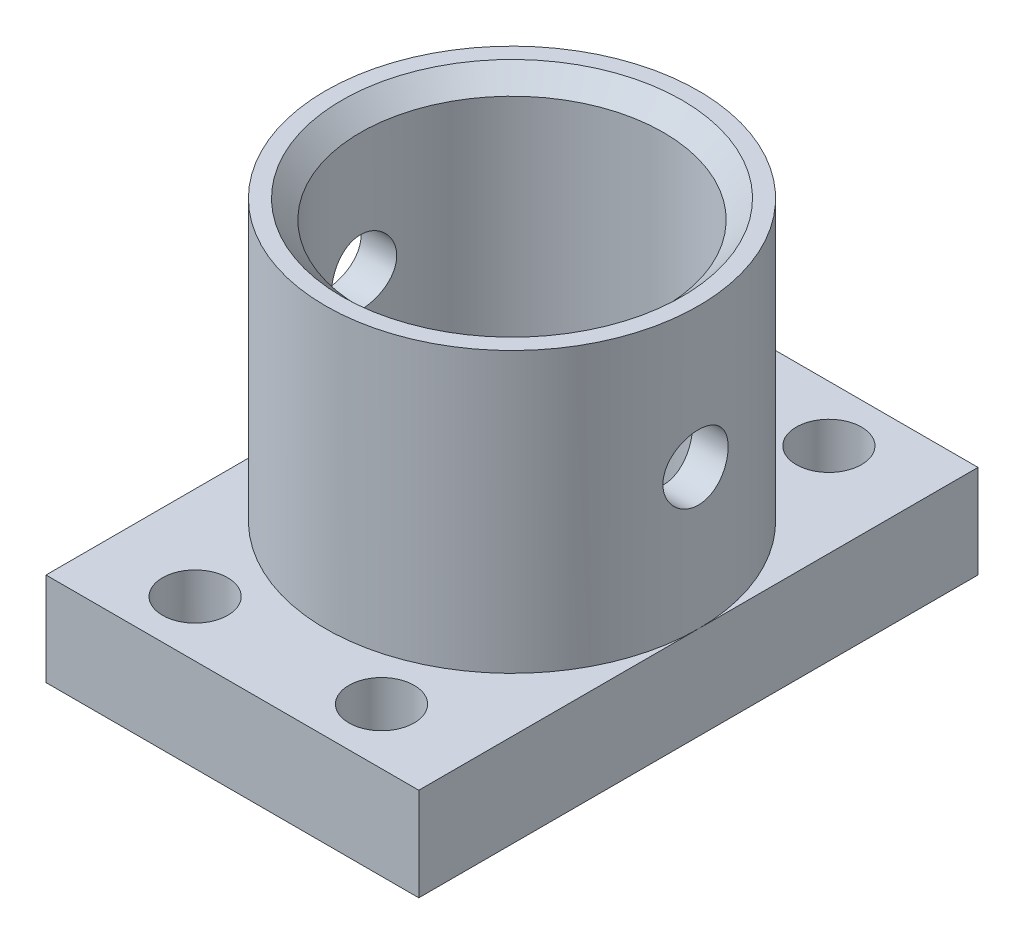
ISO-10303-21;
HEADER;
FILE_DESCRIPTION(('STEP AP214'),'2;1');
FILE_NAME('part.step','',(''),(''),'','','');
FILE_SCHEMA(('AUTOMOTIVE_DESIGN { 1 0 10303 214 1 1 1 1 }'));
ENDSEC;
DATA;
#1=APPLICATION_CONTEXT('core data for automotive mechanical design processes');
#2=APPLICATION_PROTOCOL_DEFINITION('international standard','automotive_design',2000,#1);
#3=PRODUCT_CONTEXT('',#1,'mechanical');
#4=PRODUCT('Part','Part','',(#3));
#5=PRODUCT_RELATED_PRODUCT_CATEGORY('part','',(#4));
#6=PRODUCT_DEFINITION_FORMATION('','',#4);
#7=PRODUCT_DEFINITION_CONTEXT('part definition',#1,'design');
#8=PRODUCT_DEFINITION('design','',#6,#7);
#9=PRODUCT_DEFINITION_SHAPE('','',#8);
#10=(LENGTH_UNIT() NAMED_UNIT(*) SI_UNIT(.MILLI.,.METRE.));
#11=(NAMED_UNIT(*) PLANE_ANGLE_UNIT() SI_UNIT($,.RADIAN.));
#12=(NAMED_UNIT(*) SI_UNIT($,.STERADIAN.) SOLID_ANGLE_UNIT());
#13=UNCERTAINTY_MEASURE_WITH_UNIT(LENGTH_MEASURE(1.E-05),#10,'distance_accuracy_value','');
#14=(GEOMETRIC_REPRESENTATION_CONTEXT(3) GLOBAL_UNCERTAINTY_ASSIGNED_CONTEXT((#13)) GLOBAL_UNIT_ASSIGNED_CONTEXT((#10,
#11,#12)) REPRESENTATION_CONTEXT('',''));
#15=CARTESIAN_POINT('',(0.,0.,0.));
#16=DIRECTION('',(0.,0.,1.));
#17=DIRECTION('',(1.,0.,0.));
#18=AXIS2_PLACEMENT_3D('',#15,#16,#17);
#19=CARTESIAN_POINT('',(0.,5.,0.));
#20=DIRECTION('',(0.,-1.,0.));
#21=DIRECTION('',(0.,0.,-1.));
#22=AXIS2_PLACEMENT_3D('',#19,#20,#21);
#23=PLANE('',#22);
#24=CARTESIAN_POINT('',(5.,5.,-12.));
#25=DIRECTION('',(0.,1.,0.));
#26=DIRECTION('',(0.,0.,1.));
#27=AXIS2_PLACEMENT_3D('',#24,#25,#26);
#28=CIRCLE('',#27,1.75);
#29=CARTESIAN_POINT('',(5.,5.,-10.25));
#30=VERTEX_POINT('',#29);
#31=EDGE_CURVE('E235',#30,#30,#28,.T.);
#32=ORIENTED_EDGE('',*,*,#31,.F.);
#33=EDGE_LOOP('',(#32));
#34=FACE_BOUND('',#33,.T.);
#35=CARTESIAN_POINT('',(-5.,5.,-12.));
#36=DIRECTION('',(0.,1.,0.));
#37=DIRECTION('',(0.,0.,1.));
#38=AXIS2_PLACEMENT_3D('',#35,#36,#37);
#39=CIRCLE('',#38,1.75);
#40=CARTESIAN_POINT('',(-5.,5.,-10.25));
#41=VERTEX_POINT('',#40);
#42=EDGE_CURVE('E238',#41,#41,#39,.T.);
#43=ORIENTED_EDGE('',*,*,#42,.F.);
#44=EDGE_LOOP('',(#43));
#45=FACE_BOUND('',#44,.T.);
#46=CARTESIAN_POINT('',(0.,5.,0.));
#47=DIRECTION('',(0.,1.,0.));
#48=DIRECTION('',(0.,0.,1.));
#49=AXIS2_PLACEMENT_3D('',#46,#47,#48);
#50=CIRCLE('',#49,10.);
#51=CARTESIAN_POINT('',(10.,5.,0.));
#52=VERTEX_POINT('',#51);
#53=CARTESIAN_POINT('',(-10.,5.,0.));
#54=VERTEX_POINT('',#53);
#55=EDGE_CURVE('E122',#52,#54,#50,.T.);
#56=ORIENTED_EDGE('',*,*,#55,.F.);
#57=DIRECTION('',(0.,0.,-1.));
#58=VECTOR('',#57,1.);
#59=CARTESIAN_POINT('',(10.,5.,15.));
#60=LINE('',#59,#58);
#61=CARTESIAN_POINT('',(10.,5.,-15.));
#62=VERTEX_POINT('',#61);
#63=EDGE_CURVE('E104',#52,#62,#60,.T.);
#64=ORIENTED_EDGE('',*,*,#63,.T.);
#65=DIRECTION('',(-1.,0.,0.));
#66=VECTOR('',#65,1.);
#67=CARTESIAN_POINT('',(-10.,5.,-15.));
#68=LINE('',#67,#66);
#69=CARTESIAN_POINT('',(-10.,5.,-15.));
#70=VERTEX_POINT('',#69);
#71=EDGE_CURVE('E112',#62,#70,#68,.T.);
#72=ORIENTED_EDGE('',*,*,#71,.T.);
#73=DIRECTION('',(0.,0.,1.));
#74=VECTOR('',#73,1.);
#75=CARTESIAN_POINT('',(-10.,5.,15.));
#76=LINE('',#75,#74);
#77=EDGE_CURVE('E124',#70,#54,#76,.T.);
#78=ORIENTED_EDGE('',*,*,#77,.T.);
#79=EDGE_LOOP('',(#56,#64,#72,#78));
#80=FACE_BOUND('',#79,.T.);
#81=ADVANCED_FACE('F45',(#34,#45,#80),#23,.F.);
#82=CARTESIAN_POINT('',(10.,5.,15.));
#83=DIRECTION('',(-1.,0.,0.));
#84=DIRECTION('',(0.,0.,1.));
#85=AXIS2_PLACEMENT_3D('',#82,#83,#84);
#86=PLANE('',#85);
#87=DIRECTION('',(0.,0.,-1.));
#88=VECTOR('',#87,1.);
#89=CARTESIAN_POINT('',(10.,0.,15.));
#90=LINE('',#89,#88);
#91=CARTESIAN_POINT('',(10.,0.,15.));
#92=VERTEX_POINT('',#91);
#93=CARTESIAN_POINT('',(10.,0.,-15.));
#94=VERTEX_POINT('',#93);
#95=EDGE_CURVE('E149',#92,#94,#90,.T.);
#96=ORIENTED_EDGE('',*,*,#95,.T.);
#97=DIRECTION('',(0.,-1.,0.));
#98=VECTOR('',#97,1.);
#99=CARTESIAN_POINT('',(10.,5.,-15.));
#100=LINE('',#99,#98);
#101=EDGE_CURVE('E118',#62,#94,#100,.T.);
#102=ORIENTED_EDGE('',*,*,#101,.F.);
#103=ORIENTED_EDGE('',*,*,#63,.F.);
#104=CARTESIAN_POINT('',(10.,5.,15.));
#105=VERTEX_POINT('',#104);
#106=EDGE_CURVE('E108',#105,#52,#60,.T.);
#107=ORIENTED_EDGE('',*,*,#106,.F.);
#108=DIRECTION('',(0.,-1.,0.));
#109=VECTOR('',#108,1.);
#110=CARTESIAN_POINT('',(10.,5.,15.));
#111=LINE('',#110,#109);
#112=EDGE_CURVE('E148',#105,#92,#111,.T.);
#113=ORIENTED_EDGE('',*,*,#112,.T.);
#114=EDGE_LOOP('',(#96,#102,#103,#107,#113));
#115=FACE_BOUND('',#114,.T.);
#116=ADVANCED_FACE('F116',(#115),#86,.F.);
#117=CARTESIAN_POINT('',(-10.,5.,-15.));
#118=DIRECTION('',(0.,0.,1.));
#119=DIRECTION('',(1.,0.,0.));
#120=AXIS2_PLACEMENT_3D('',#117,#118,#119);
#121=PLANE('',#120);
#122=DIRECTION('',(-1.,0.,0.));
#123=VECTOR('',#122,1.);
#124=CARTESIAN_POINT('',(-10.,0.,-15.));
#125=LINE('',#124,#123);
#126=CARTESIAN_POINT('',(-10.,0.,-15.));
#127=VERTEX_POINT('',#126);
#128=EDGE_CURVE('E152',#94,#127,#125,.T.);
#129=ORIENTED_EDGE('',*,*,#128,.T.);
#130=DIRECTION('',(0.,-1.,0.));
#131=VECTOR('',#130,1.);
#132=CARTESIAN_POINT('',(-10.,5.,-15.));
#133=LINE('',#132,#131);
#134=EDGE_CURVE('E136',#70,#127,#133,.T.);
#135=ORIENTED_EDGE('',*,*,#134,.F.);
#136=ORIENTED_EDGE('',*,*,#71,.F.);
#137=ORIENTED_EDGE('',*,*,#101,.T.);
#138=EDGE_LOOP('',(#129,#135,#136,#137));
#139=FACE_BOUND('',#138,.T.);
#140=ADVANCED_FACE('F221',(#139),#121,.F.);
#141=CARTESIAN_POINT('',(-10.,5.,15.));
#142=DIRECTION('',(1.,0.,0.));
#143=DIRECTION('',(0.,0.,-1.));
#144=AXIS2_PLACEMENT_3D('',#141,#142,#143);
#145=PLANE('',#144);
#146=DIRECTION('',(0.,0.,1.));
#147=VECTOR('',#146,1.);
#148=CARTESIAN_POINT('',(-10.,0.,15.));
#149=LINE('',#148,#147);
#150=CARTESIAN_POINT('',(-10.,0.,15.));
#151=VERTEX_POINT('',#150);
#152=EDGE_CURVE('E155',#127,#151,#149,.T.);
#153=ORIENTED_EDGE('',*,*,#152,.T.);
#154=DIRECTION('',(0.,-1.,0.));
#155=VECTOR('',#154,1.);
#156=CARTESIAN_POINT('',(-10.,5.,15.));
#157=LINE('',#156,#155);
#158=CARTESIAN_POINT('',(-10.,5.,15.));
#159=VERTEX_POINT('',#158);
#160=EDGE_CURVE('E162',#159,#151,#157,.T.);
#161=ORIENTED_EDGE('',*,*,#160,.F.);
#162=EDGE_CURVE('E143',#54,#159,#76,.T.);
#163=ORIENTED_EDGE('',*,*,#162,.F.);
#164=ORIENTED_EDGE('',*,*,#77,.F.);
#165=ORIENTED_EDGE('',*,*,#134,.T.);
#166=EDGE_LOOP('',(#153,#161,#163,#164,#165));
#167=FACE_BOUND('',#166,.T.);
#168=ADVANCED_FACE('F218',(#167),#145,.F.);
#169=CARTESIAN_POINT('',(-10.,5.,15.));
#170=DIRECTION('',(0.,0.,-1.));
#171=DIRECTION('',(-1.,0.,0.));
#172=AXIS2_PLACEMENT_3D('',#169,#170,#171);
#173=PLANE('',#172);
#174=DIRECTION('',(1.,0.,0.));
#175=VECTOR('',#174,1.);
#176=CARTESIAN_POINT('',(-10.,0.,15.));
#177=LINE('',#176,#175);
#178=EDGE_CURVE('E96',#151,#92,#177,.T.);
#179=ORIENTED_EDGE('',*,*,#178,.T.);
#180=ORIENTED_EDGE('',*,*,#112,.F.);
#181=DIRECTION('',(1.,0.,0.));
#182=VECTOR('',#181,1.);
#183=CARTESIAN_POINT('',(-10.,5.,15.));
#184=LINE('',#183,#182);
#185=EDGE_CURVE('E75',#159,#105,#184,.T.);
#186=ORIENTED_EDGE('',*,*,#185,.F.);
#187=ORIENTED_EDGE('',*,*,#160,.T.);
#188=EDGE_LOOP('',(#179,#180,#186,#187));
#189=FACE_BOUND('',#188,.T.);
#190=ADVANCED_FACE('F211',(#189),#173,.F.);
#191=CARTESIAN_POINT('',(-4.99999999999907,5.,12.));
#192=DIRECTION('',(0.,1.,0.));
#193=DIRECTION('',(0.,0.,1.));
#194=AXIS2_PLACEMENT_3D('',#191,#192,#193);
#195=CIRCLE('',#194,1.74999999999967);
#196=CARTESIAN_POINT('',(-4.99999999999907,5.,13.7499999999997));
#197=VERTEX_POINT('',#196);
#198=EDGE_CURVE('E250',#197,#197,#195,.T.);
#199=ORIENTED_EDGE('',*,*,#198,.F.);
#200=EDGE_LOOP('',(#199));
#201=FACE_BOUND('',#200,.T.);
#202=CARTESIAN_POINT('',(5.00000000000093,5.,12.));
#203=DIRECTION('',(0.,1.,0.));
#204=DIRECTION('',(0.,0.,1.));
#205=AXIS2_PLACEMENT_3D('',#202,#203,#204);
#206=CIRCLE('',#205,1.75);
#207=CARTESIAN_POINT('',(5.00000000000093,5.,13.75));
#208=VERTEX_POINT('',#207);
#209=EDGE_CURVE('E435',#208,#208,#206,.T.);
#210=ORIENTED_EDGE('',*,*,#209,.F.);
#211=EDGE_LOOP('',(#210));
#212=FACE_BOUND('',#211,.T.);
#213=EDGE_CURVE('E69',#54,#52,#50,.T.);
#214=ORIENTED_EDGE('',*,*,#213,.F.);
#215=ORIENTED_EDGE('',*,*,#162,.T.);
#216=ORIENTED_EDGE('',*,*,#185,.T.);
#217=ORIENTED_EDGE('',*,*,#106,.T.);
#218=EDGE_LOOP('',(#214,#215,#216,#217));
#219=FACE_BOUND('',#218,.T.);
#220=ADVANCED_FACE('F109',(#201,#212,#219),#23,.F.);
#221=CARTESIAN_POINT('',(0.,0.,0.));
#222=DIRECTION('',(0.,-1.,0.));
#223=DIRECTION('',(0.,0.,-1.));
#224=AXIS2_PLACEMENT_3D('',#221,#222,#223);
#225=PLANE('',#224);
#226=CARTESIAN_POINT('',(-4.99999999999907,0.,12.));
#227=DIRECTION('',(0.,-1.,0.));
#228=DIRECTION('',(0.,0.,-1.));
#229=AXIS2_PLACEMENT_3D('',#226,#227,#228);
#230=CIRCLE('',#229,1.74999999999967);
#231=CARTESIAN_POINT('',(-4.99999999999907,0.,10.2500000000003));
#232=VERTEX_POINT('',#231);
#233=EDGE_CURVE('E443',#232,#232,#230,.F.);
#234=ORIENTED_EDGE('',*,*,#233,.T.);
#235=EDGE_LOOP('',(#234));
#236=FACE_BOUND('',#235,.T.);
#237=CARTESIAN_POINT('',(5.00000000000093,0.,12.));
#238=DIRECTION('',(0.,-1.,0.));
#239=DIRECTION('',(0.,0.,-1.));
#240=AXIS2_PLACEMENT_3D('',#237,#238,#239);
#241=CIRCLE('',#240,1.75);
#242=CARTESIAN_POINT('',(5.00000000000093,0.,10.25));
#243=VERTEX_POINT('',#242);
#244=EDGE_CURVE('E438',#243,#243,#241,.F.);
#245=ORIENTED_EDGE('',*,*,#244,.T.);
#246=EDGE_LOOP('',(#245));
#247=FACE_BOUND('',#246,.T.);
#248=CARTESIAN_POINT('',(5.,0.,-12.));
#249=DIRECTION('',(0.,-1.,0.));
#250=DIRECTION('',(0.,0.,-1.));
#251=AXIS2_PLACEMENT_3D('',#248,#249,#250);
#252=CIRCLE('',#251,1.75);
#253=CARTESIAN_POINT('',(5.,0.,-13.75));
#254=VERTEX_POINT('',#253);
#255=EDGE_CURVE('E247',#254,#254,#252,.F.);
#256=ORIENTED_EDGE('',*,*,#255,.T.);
#257=EDGE_LOOP('',(#256));
#258=FACE_BOUND('',#257,.T.);
#259=CARTESIAN_POINT('',(-5.,0.,-12.));
#260=DIRECTION('',(0.,-1.,0.));
#261=DIRECTION('',(0.,0.,-1.));
#262=AXIS2_PLACEMENT_3D('',#259,#260,#261);
#263=CIRCLE('',#262,1.75);
#264=CARTESIAN_POINT('',(-5.,0.,-13.75));
#265=VERTEX_POINT('',#264);
#266=EDGE_CURVE('E241',#265,#265,#263,.F.);
#267=ORIENTED_EDGE('',*,*,#266,.T.);
#268=EDGE_LOOP('',(#267));
#269=FACE_BOUND('',#268,.T.);
#270=CARTESIAN_POINT('',(0.,0.,0.));
#271=DIRECTION('',(0.,1.,0.));
#272=DIRECTION('',(0.,0.,1.));
#273=AXIS2_PLACEMENT_3D('',#270,#271,#272);
#274=CIRCLE('',#273,8.125);
#275=CARTESIAN_POINT('',(0.,0.,8.125));
#276=VERTEX_POINT('',#275);
#277=EDGE_CURVE('E128',#276,#276,#274,.T.);
#278=ORIENTED_EDGE('',*,*,#277,.T.);
#279=EDGE_LOOP('',(#278));
#280=FACE_BOUND('',#279,.T.);
#281=ORIENTED_EDGE('',*,*,#95,.F.);
#282=ORIENTED_EDGE('',*,*,#178,.F.);
#283=ORIENTED_EDGE('',*,*,#152,.F.);
#284=ORIENTED_EDGE('',*,*,#128,.F.);
#285=EDGE_LOOP('',(#281,#282,#283,#284));
#286=FACE_BOUND('',#285,.T.);
#287=ADVANCED_FACE('F210',(#236,#247,#258,#269,#280,#286),#225,.T.);
#288=CARTESIAN_POINT('',(0.,20.,0.));
#289=DIRECTION('',(0.,1.,0.));
#290=DIRECTION('',(0.,0.,1.));
#291=AXIS2_PLACEMENT_3D('',#288,#289,#290);
#292=PLANE('',#291);
#293=CARTESIAN_POINT('',(0.,20.,0.));
#294=DIRECTION('',(0.,1.,0.));
#295=DIRECTION('',(0.,0.,1.));
#296=AXIS2_PLACEMENT_3D('',#293,#294,#295);
#297=CIRCLE('',#296,9.125);
#298=CARTESIAN_POINT('',(0.,20.,9.125));
#299=VERTEX_POINT('',#298);
#300=EDGE_CURVE('E11',#299,#299,#297,.F.);
#301=ORIENTED_EDGE('',*,*,#300,.T.);
#302=EDGE_LOOP('',(#301));
#303=FACE_BOUND('',#302,.T.);
#304=CARTESIAN_POINT('',(0.,20.,0.));
#305=DIRECTION('',(0.,1.,0.));
#306=DIRECTION('',(0.,0.,1.));
#307=AXIS2_PLACEMENT_3D('',#304,#305,#306);
#308=CIRCLE('',#307,10.);
#309=CARTESIAN_POINT('',(0.,20.,10.));
#310=VERTEX_POINT('',#309);
#311=EDGE_CURVE('E127',#310,#310,#308,.T.);
#312=ORIENTED_EDGE('',*,*,#311,.T.);
#313=EDGE_LOOP('',(#312));
#314=FACE_BOUND('',#313,.T.);
#315=ADVANCED_FACE('F205',(#303,#314),#292,.T.);
#316=CARTESIAN_POINT('',(0.,20.,0.));
#317=DIRECTION('',(0.,-1.,0.));
#318=DIRECTION('',(0.,0.,-1.));
#319=AXIS2_PLACEMENT_3D('',#316,#317,#318);
#320=CYLINDRICAL_SURFACE('',#319,10.);
#321=CARTESIAN_POINT('',(-10.,10.75,0.));
#322=CARTESIAN_POINT('',(-9.99999828550993,10.7500038423549,-0.0975002189978536));
#323=CARTESIAN_POINT('',(-9.99855925305814,10.7581757812618,-0.195051825485916));
#324=CARTESIAN_POINT('',(-9.99295728726595,10.7906311549575,-0.387414018862526));
#325=CARTESIAN_POINT('',(-9.98879192868944,10.8149289349511,-0.482222086719285));
#326=CARTESIAN_POINT('',(-9.9782040279162,10.878875737995,-0.666286716106654));
#327=CARTESIAN_POINT('',(-9.97178340721726,10.9185116957341,-0.755547927638464));
#328=CARTESIAN_POINT('',(-9.95738907196248,11.011974384061,-0.92614297536967));
#329=CARTESIAN_POINT('',(-9.94941551484514,11.065799676313,-1.00747761392112));
#330=CARTESIAN_POINT('',(-9.93270416872809,11.1867136097796,-1.16077458064916));
#331=CARTESIAN_POINT('',(-9.92395990203815,11.2539221396422,-1.23264164981102));
#332=CARTESIAN_POINT('',(-9.90674166321202,11.3994367369352,-1.36414009649868));
#333=CARTESIAN_POINT('',(-9.89826770904785,11.4777435403702,-1.4237706618935));
#334=CARTESIAN_POINT('',(-9.88248675123969,11.6438935627265,-1.52949079919484));
#335=CARTESIAN_POINT('',(-9.87518811175402,11.7317982531034,-1.57548512024472));
#336=CARTESIAN_POINT('',(-9.86267461199112,11.9142353924078,-1.65201780170523));
#337=CARTESIAN_POINT('',(-9.85745959606453,12.0087673456498,-1.68255731665529));
#338=CARTESIAN_POINT('',(-9.84976858920675,12.2007620314414,-1.7270111605903));
#339=CARTESIAN_POINT('',(-9.84726541290427,12.2981854220943,-1.74109061199911));
#340=CARTESIAN_POINT('',(-9.84519938186275,12.4940414676184,-1.75273685009326));
#341=CARTESIAN_POINT('',(-9.84563629768553,12.5924740431367,-1.75030492528908));
#342=CARTESIAN_POINT('',(-9.84937629026662,12.7863688504328,-1.72913170713863));
#343=CARTESIAN_POINT('',(-9.85264661495795,12.8818521571407,-1.71057677642296));
#344=CARTESIAN_POINT('',(-9.86163360747697,13.0683292323422,-1.6579771161493));
#345=CARTESIAN_POINT('',(-9.8673503670103,13.1593228323945,-1.62393180592483));
#346=CARTESIAN_POINT('',(-9.88062103436221,13.3347905445086,-1.54113146110185));
#347=CARTESIAN_POINT('',(-9.88818446324518,13.4192277798609,-1.49229986742933));
#348=CARTESIAN_POINT('',(-9.9042897774119,13.5787803690809,-1.38136737793409));
#349=CARTESIAN_POINT('',(-9.91283174952347,13.6538948944947,-1.31926530417514));
#350=CARTESIAN_POINT('',(-9.93007513845501,13.7937478344988,-1.18254340376588));
#351=CARTESIAN_POINT('',(-9.93877713730826,13.8583301455674,-1.10776386811214));
#352=CARTESIAN_POINT('',(-9.95525225092692,13.9740549442254,-0.94834768117737));
#353=CARTESIAN_POINT('',(-9.96302535851272,14.0251973279382,-0.863710953717842));
#354=CARTESIAN_POINT('',(-9.9767796289067,14.1126081081559,-0.686829936517548));
#355=CARTESIAN_POINT('',(-9.98275901510707,14.148861771016,-0.594578218974182));
#356=CARTESIAN_POINT('',(-9.99223809398106,14.2053161469363,-0.405166996122792));
#357=CARTESIAN_POINT('',(-9.99573801564457,14.2255183424439,-0.308007944917597));
#358=CARTESIAN_POINT('',(-9.99983277218685,14.2490825152256,-0.11288455469102));
#359=CARTESIAN_POINT('',(-10.0004645449945,14.2526586288013,-0.0149468247783651));
#360=CARTESIAN_POINT('',(-9.99885332409997,14.2434413739277,0.180127849653308));
#361=CARTESIAN_POINT('',(-9.99661045277387,14.2306487023114,0.277264828083825));
#362=CARTESIAN_POINT('',(-9.98952487073635,14.1892351057355,0.467312333780238));
#363=CARTESIAN_POINT('',(-9.98469972832698,14.1607211005893,0.560246871912318));
#364=CARTESIAN_POINT('',(-9.97298839379761,14.0887888897806,0.740016494745392));
#365=CARTESIAN_POINT('',(-9.96610207629161,14.0453697773825,0.826851207983177));
#366=CARTESIAN_POINT('',(-9.95094034029615,13.9443758119241,0.992880142059946));
#367=CARTESIAN_POINT('',(-9.94265215093101,13.886668321633,1.07199249157212));
#368=CARTESIAN_POINT('',(-9.92564223228564,13.7589169998669,1.21948701016864));
#369=CARTESIAN_POINT('',(-9.91692046810972,13.6888721742803,1.28786831373204));
#370=CARTESIAN_POINT('',(-9.89990574738798,13.5374705049389,1.4127611499402));
#371=CARTESIAN_POINT('',(-9.89161886212633,13.4559930439062,1.46912742425077));
#372=CARTESIAN_POINT('',(-9.87652886958087,13.2846001692963,1.5673730724115));
#373=CARTESIAN_POINT('',(-9.86972571190741,13.1946850424234,1.60925293827065));
#374=CARTESIAN_POINT('',(-9.85841982497657,13.0093608772062,1.67712403732702));
#375=CARTESIAN_POINT('',(-9.8539069632688,12.9139781523736,1.70318535525293));
#376=CARTESIAN_POINT('',(-9.84766806310623,12.7201026745908,1.73889853467115));
#377=CARTESIAN_POINT('',(-9.84594175488491,12.6216102236348,1.74855198461554));
#378=CARTESIAN_POINT('',(-9.84548385302428,12.4257632938701,1.75112765296471));
#379=CARTESIAN_POINT('',(-9.84671130349954,12.3284118452215,1.74427868698102));
#380=CARTESIAN_POINT('',(-9.85193244878435,12.1362698766224,1.71454110321866));
#381=CARTESIAN_POINT('',(-9.85592613187508,12.0414793458245,1.6916525533898));
#382=CARTESIAN_POINT('',(-9.8662135332826,11.8572518573066,1.63057667594736));
#383=CARTESIAN_POINT('',(-9.87250399231302,11.7678075212446,1.59241102026491));
#384=CARTESIAN_POINT('',(-9.88667897086147,11.5965545722039,1.50188835743546));
#385=CARTESIAN_POINT('',(-9.89456358259495,11.5147464013474,1.44953052926745));
#386=CARTESIAN_POINT('',(-9.91116727642969,11.3599357127572,1.33130126747894));
#387=CARTESIAN_POINT('',(-9.91989591712334,11.2870622415423,1.26526217529781));
#388=CARTESIAN_POINT('',(-9.93712979259031,11.1533537998188,1.12189721587278));
#389=CARTESIAN_POINT('',(-9.94563497547267,11.092521604455,1.04456875389407));
#390=CARTESIAN_POINT('',(-9.96153989384367,10.9841905933561,0.880110187392864));
#391=CARTESIAN_POINT('',(-9.9689306174897,10.9367980008952,0.792909225494813));
#392=CARTESIAN_POINT('',(-9.98168617899541,10.8574087241303,0.611686626292545));
#393=CARTESIAN_POINT('',(-9.98705298938607,10.8253970410154,0.517671737050139));
#394=CARTESIAN_POINT('',(-9.99401440275851,10.7844544193603,0.352770470007627));
#395=CARTESIAN_POINT('',(-9.99624674471591,10.7715552330515,0.282869378105653));
#396=CARTESIAN_POINT('',(-9.99924015281871,10.7543267106156,0.141987928142367));
#397=CARTESIAN_POINT('',(-10.0000012486312,10.7499972016845,0.0710075918726424));
#398=CARTESIAN_POINT('',(-10.,10.75,0.));
#399=B_SPLINE_CURVE_WITH_KNOTS('',3,(#321,#322,#323,#324,#325,#326,#327,#328,#329,#330,#331,
#332,#333,#334,#335,#336,#337,#338,#339,#340,#341,#342,#343,#344,#345,#346,#347,#348,#349,#350,
#351,#352,#353,#354,#355,#356,#357,#358,#359,#360,#361,#362,#363,#364,#365,#366,#367,#368,#369,
#370,#371,#372,#373,#374,#375,#376,#377,#378,#379,#380,#381,#382,#383,#384,#385,#386,#387,#388,
#389,#390,#391,#392,#393,#394,#395,#396,#397,#398),.UNSPECIFIED.,.T.,.F.,(4,2,2,2,2,2,2,2,2,2,2,
2,2,2,2,2,2,2,2,2,2,2,2,2,2,2,2,2,2,2,2,2,2,2,2,2,2,2,4),(0.,0.292241055917434,
0.584742432339775,0.876995197804954,1.16921834975457,1.46418766399023,1.75917654887268,
2.05617988256742,2.35316102557938,2.64713665953463,2.94108935255952,3.23168883340741,
3.52229920845483,3.81444078353632,4.10660830094941,4.4027750486598,4.69894408536268,
4.99540550415932,5.2918395398163,5.58444486552995,5.87703773520185,6.16766481502154,
6.4583095779465,6.75176075704314,7.04523559252421,7.34207911218901,7.63891254902192,
7.93442106632098,8.22990097369568,8.52130751120699,8.81271281421605,9.10370618969572,
9.39471640281476,9.68952963439969,9.98441073248091,10.2815613716728,10.5784216510768,
10.7912596559022,11.0040933688959),.UNSPECIFIED.);
#400=CARTESIAN_POINT('',(-10.,10.75,0.));
#401=VERTEX_POINT('',#400);
#402=EDGE_CURVE('E197',#401,#401,#399,.T.);
#403=ORIENTED_EDGE('',*,*,#402,.T.);
#404=EDGE_LOOP('',(#403));
#405=FACE_BOUND('',#404,.T.);
#406=CARTESIAN_POINT('',(9.84568433375761,12.5,-1.75));
#407=CARTESIAN_POINT('',(9.84568614971877,12.4025126674052,-1.74999614707769));
#408=CARTESIAN_POINT('',(9.84714794833416,12.3049739164914,-1.7418262952061));
#409=CARTESIAN_POINT('',(9.85283112133241,12.1126384227064,-1.7093799629126));
#410=CARTESIAN_POINT('',(9.85705496167591,12.0178442092191,-1.68508908929617));
#411=CARTESIAN_POINT('',(9.86776951325615,11.8338089068026,-1.62116248086999));
#412=CARTESIAN_POINT('',(9.87425824580223,11.7445630505487,-1.58154013691065));
#413=CARTESIAN_POINT('',(9.88876912660767,11.5739938433928,-1.48810953050795));
#414=CARTESIAN_POINT('',(9.89679112283797,11.4926697082273,-1.43430267431371));
#415=CARTESIAN_POINT('',(9.91356194372765,11.3393613449128,-1.31340755862099));
#416=CARTESIAN_POINT('',(9.92231707580156,11.2674755945092,-1.24619527573238));
#417=CARTESIAN_POINT('',(9.93951178241083,11.1359409600907,-1.10066526787948));
#418=CARTESIAN_POINT('',(9.94795133745731,11.0762928308095,-1.0223468584679));
#419=CARTESIAN_POINT('',(9.96363106264343,10.9705539528198,-0.856186208091837));
#420=CARTESIAN_POINT('',(9.97086294471024,10.9245553304008,-0.768284492208793));
#421=CARTESIAN_POINT('',(9.98324213395081,10.8480138822839,-0.585853799604155));
#422=CARTESIAN_POINT('',(9.98838959044574,10.8174699494255,-0.491325298172315));
#423=CARTESIAN_POINT('',(9.99597541274984,10.7730074227211,-0.299343066316541));
#424=CARTESIAN_POINT('',(9.99844076058663,10.7589231358463,-0.201928793544091));
#425=CARTESIAN_POINT('',(10.0004774070068,10.7472640652577,-0.0060907403488341));
#426=CARTESIAN_POINT('',(10.0000489215371,10.7496880496454,0.0923329641997548));
#427=CARTESIAN_POINT('',(9.99636743323528,10.7708483238398,0.286261787878407));
#428=CARTESIAN_POINT('',(9.99314531364367,10.7894062611187,0.381787038143539));
#429=CARTESIAN_POINT('',(9.98427309789633,10.8420263299803,0.568346432353335));
#430=CARTESIAN_POINT('',(9.9786229219846,10.8760889708585,0.65938042866126));
#431=CARTESIAN_POINT('',(9.96547722388572,10.9589259432928,0.834898543664971));
#432=CARTESIAN_POINT('',(9.9579726245404,11.0077729149055,0.919347671813221));
#433=CARTESIAN_POINT('',(9.94195038789881,11.1187386308372,1.07891760175991));
#434=CARTESIAN_POINT('',(9.9334326604727,11.1808585563359,1.15403757240155));
#435=CARTESIAN_POINT('',(9.91619557457141,11.3175936042963,1.29387175378861));
#436=CARTESIAN_POINT('',(9.9074750428737,11.3923646757315,1.35843341984165));
#437=CARTESIAN_POINT('',(9.89092484526781,11.551756406593,1.47412052948707));
#438=CARTESIAN_POINT('',(9.8830951892972,11.6363771758697,1.52524582320742));
#439=CARTESIAN_POINT('',(9.86921219314739,11.8132528957741,1.61264408867291));
#440=CARTESIAN_POINT('',(9.86316122762236,11.9055178431862,1.64889723053682));
#441=CARTESIAN_POINT('',(9.85355879963018,12.0949579629474,1.70534655701126));
#442=CARTESIAN_POINT('',(9.85000709296117,12.192132654572,1.72554431041425));
#443=CARTESIAN_POINT('',(9.84585299926953,12.3872648297724,1.74909167072955));
#444=CARTESIAN_POINT('',(9.84521243389554,12.4851952054591,1.75265938935999));
#445=CARTESIAN_POINT('',(9.84685127712912,12.6802531937449,1.74342797042691));
#446=CARTESIAN_POINT('',(9.84913056083862,12.7773808405022,1.73062953293436));
#447=CARTESIAN_POINT('',(9.85631689910622,12.9673741090453,1.68921556854974));
#448=CARTESIAN_POINT('',(9.86120528899016,13.0602649784536,1.66071234224036));
#449=CARTESIAN_POINT('',(9.87304321959131,13.2399519987381,1.58881621009289));
#450=CARTESIAN_POINT('',(9.87999289484608,13.326747751336,1.54542233233126));
#451=CARTESIAN_POINT('',(9.89525837117709,13.4927476531848,1.44446686852147));
#452=CARTESIAN_POINT('',(9.90358729231133,13.5718660358355,1.38676627772465));
#453=CARTESIAN_POINT('',(9.92063500418771,13.7193759108595,1.25902478392813));
#454=CARTESIAN_POINT('',(9.9293538252426,13.7877665673365,1.1889829202078));
#455=CARTESIAN_POINT('',(9.94632045663045,13.9126831900268,1.03757773333283));
#456=CARTESIAN_POINT('',(9.95456167481406,13.9690632182896,0.956093151851286));
#457=CARTESIAN_POINT('',(9.96953684410525,14.06733296601,0.784682023768012));
#458=CARTESIAN_POINT('',(9.97627084771867,14.1092231902674,0.694755771398285));
#459=CARTESIAN_POINT('',(9.98744431327328,14.1771004381826,0.509435756884877));
#460=CARTESIAN_POINT('',(9.99189451501047,14.2031620058661,0.41406997356929));
#461=CARTESIAN_POINT('',(9.99804452672039,14.2388814120089,0.220230515016631));
#462=CARTESIAN_POINT('',(9.99974458725255,14.2485407448445,0.121757123740525));
#463=CARTESIAN_POINT('',(10.0001986676664,14.2511349878834,-0.0740972279384956));
#464=CARTESIAN_POINT('',(9.9989916888787,14.2442913038633,-0.171475235528587));
#465=CARTESIAN_POINT('',(9.99384747273868,14.2145549982948,-0.363671714431673));
#466=CARTESIAN_POINT('',(9.98991025464598,14.1916624899576,-0.458490203795062));
#467=CARTESIAN_POINT('',(9.97974688526102,14.1305666268592,-0.642778931888429));
#468=CARTESIAN_POINT('',(9.97352382539293,14.092383944614,-0.732256205080807));
#469=CARTESIAN_POINT('',(9.95946589247331,14.0018169358253,-0.903568024982697));
#470=CARTESIAN_POINT('',(9.95163093054382,13.9494318261296,-0.985402149898061));
#471=CARTESIAN_POINT('',(9.93509204541497,13.8311708115637,-1.14021551395227));
#472=CARTESIAN_POINT('',(9.9263784362471,13.7651335847967,-1.21307049932053));
#473=CARTESIAN_POINT('',(9.90912905327679,13.6217801885222,-1.34674250927088));
#474=CARTESIAN_POINT('',(9.90059332163408,13.5444613790832,-1.40755670839287));
#475=CARTESIAN_POINT('',(9.88459302297716,13.3800123132252,-1.51586622368385));
#476=CARTESIAN_POINT('',(9.87713744439718,13.2928094180086,-1.56325260200568));
#477=CARTESIAN_POINT('',(9.86424848595999,13.1115831313708,-1.64262974084897));
#478=CARTESIAN_POINT('',(9.8588131298501,13.0175665135605,-1.6746355562061));
#479=CARTESIAN_POINT('',(9.85175783194062,12.8526805338023,-1.71556325785051));
#480=CARTESIAN_POINT('',(9.84949326196896,12.7827974620357,-1.72845578041526));
#481=CARTESIAN_POINT('',(9.84645586764426,12.6419519998908,-1.74567546273085));
#482=CARTESIAN_POINT('',(9.84568301138667,12.5709896326292,-1.75000280567262));
#483=CARTESIAN_POINT('',(9.84568433375761,12.5,-1.75));
#484=B_SPLINE_CURVE_WITH_KNOTS('',3,(#406,#407,#408,#409,#410,#411,#412,#413,#414,#415,#416,
#417,#418,#419,#420,#421,#422,#423,#424,#425,#426,#427,#428,#429,#430,#431,#432,#433,#434,#435,
#436,#437,#438,#439,#440,#441,#442,#443,#444,#445,#446,#447,#448,#449,#450,#451,#452,#453,#454,
#455,#456,#457,#458,#459,#460,#461,#462,#463,#464,#465,#466,#467,#468,#469,#470,#471,#472,#473,
#474,#475,#476,#477,#478,#479,#480,#481,#482,#483),.UNSPECIFIED.,.T.,.F.,(4,2,2,2,2,2,2,2,2,2,2,
2,2,2,2,2,2,2,2,2,2,2,2,2,2,2,2,2,2,2,2,2,2,2,2,2,2,2,4),(0.,0.292202329923689,
0.584665895961619,0.876874592267837,1.16905432996191,1.4640743349544,1.75911252931879,
2.05609898984408,2.3530641715019,2.64701343935409,2.94094077204019,3.2316596197882,
3.52238801770299,3.8145687056272,4.10677540597687,4.40288870912171,4.69900531503459,
4.99551547662587,5.29199666226917,5.58457818931964,5.87714720145928,6.16765078589467,
6.45817333531593,6.75163754038524,7.04512460061543,7.34199657440749,7.63885820465187,
7.93431071913838,8.22973631406722,8.5212205564001,8.81270274257226,9.10379216440069,
9.3948976407859,9.68966278421802,9.98449701472035,10.2816588511069,10.5785292234368,
10.7913135839539,11.004093393418),.UNSPECIFIED.);
#485=CARTESIAN_POINT('',(9.84568433375761,12.5,-1.75));
#486=VERTEX_POINT('',#485);
#487=EDGE_CURVE('E190',#486,#486,#484,.T.);
#488=ORIENTED_EDGE('',*,*,#487,.T.);
#489=EDGE_LOOP('',(#488));
#490=FACE_BOUND('',#489,.T.);
#491=ORIENTED_EDGE('',*,*,#311,.F.);
#492=EDGE_LOOP('',(#491));
#493=FACE_BOUND('',#492,.T.);
#494=ORIENTED_EDGE('',*,*,#55,.T.);
#495=ORIENTED_EDGE('',*,*,#213,.T.);
#496=EDGE_LOOP('',(#494,#495));
#497=FACE_BOUND('',#496,.T.);
#498=ADVANCED_FACE('F130',(#405,#490,#493,#497),#320,.T.);
#499=CARTESIAN_POINT('',(0.,20.,0.));
#500=DIRECTION('',(0.,-1.,0.));
#501=DIRECTION('',(0.,0.,-1.));
#502=AXIS2_PLACEMENT_3D('',#499,#500,#501);
#503=CYLINDRICAL_SURFACE('',#502,8.125);
#504=CARTESIAN_POINT('',(-7.93430053627918,12.5,-1.75));
#505=CARTESIAN_POINT('',(-7.93430249690147,12.5970670621438,-1.74999661230737));
#506=CARTESIAN_POINT('',(-7.93610118713902,12.6941751932588,-1.74189652728655));
#507=CARTESIAN_POINT('',(-7.94308887367137,12.885632549852,-1.70974409680701));
#508=CARTESIAN_POINT('',(-7.94828036920056,12.9799796879378,-1.68567999161129));
#509=CARTESIAN_POINT('',(-7.96143904518587,13.1631177888523,-1.62239016663505));
#510=CARTESIAN_POINT('',(-7.96940323193842,13.2519146229211,-1.58318079437745));
#511=CARTESIAN_POINT('',(-7.98720633266891,13.4216709874704,-1.49075986941964));
#512=CARTESIAN_POINT('',(-7.99704519593805,13.5026307298498,-1.43754869544451));
#513=CARTESIAN_POINT('',(-8.01766914938789,13.6557429778436,-1.31770536412788));
#514=CARTESIAN_POINT('',(-8.02846603093463,13.7277483877445,-1.25088727395259));
#515=CARTESIAN_POINT('',(-8.04968615437627,13.8596204866166,-1.10612827714742));
#516=CARTESIAN_POINT('',(-8.06010936772089,13.9194862496728,-1.02818652286558));
#517=CARTESIAN_POINT('',(-8.07953592770035,14.0259595102489,-0.862408682022107));
#518=CARTESIAN_POINT('',(-8.0885237405055,14.0724258398799,-0.774479951482789));
#519=CARTESIAN_POINT('',(-8.10393375938305,14.1498683555072,-0.591836307292795));
#520=CARTESIAN_POINT('',(-8.11035624446119,14.1808462261248,-0.497122132951009));
#521=CARTESIAN_POINT('',(-8.11982864671963,14.2259707061699,-0.30512513330724));
#522=CARTESIAN_POINT('',(-8.122928377929,14.2403661679123,-0.207903294027077));
#523=CARTESIAN_POINT('',(-8.12557850639105,14.2526949493864,-0.0123784149194143));
#524=CARTESIAN_POINT('',(-8.12512929787732,14.2506300976102,0.0859245036050586));
#525=CARTESIAN_POINT('',(-8.1207703286543,14.2302828346902,0.279106587165055));
#526=CARTESIAN_POINT('',(-8.11691779918975,14.212268621526,0.374015481671565));
#527=CARTESIAN_POINT('',(-8.10625014477088,14.1609610084417,0.559430747972448));
#528=CARTESIAN_POINT('',(-8.09943488856503,14.1276669316059,0.649936924524801));
#529=CARTESIAN_POINT('',(-8.08351508891384,14.0465053943395,0.824725928340312));
#530=CARTESIAN_POINT('',(-8.07439455786494,13.9985356445968,0.908959742811746));
#531=CARTESIAN_POINT('',(-8.05486526330894,13.8894606114485,1.06828015810194));
#532=CARTESIAN_POINT('',(-8.04445632936781,13.8283535894133,1.14336554612532));
#533=CARTESIAN_POINT('',(-8.02324781242001,13.6932763909827,1.28385219925011));
#534=CARTESIAN_POINT('',(-8.01244458508406,13.6190714808141,1.34902741253443));
#535=CARTESIAN_POINT('',(-7.99186234625534,13.4606737794159,1.46604978934685));
#536=CARTESIAN_POINT('',(-7.98208336085433,13.3764807338631,1.51789661339376));
#537=CARTESIAN_POINT('',(-7.96464762452082,13.2001387866318,1.60688673158375));
#538=CARTESIAN_POINT('',(-7.95699689373671,13.1079682644196,1.64398844092953));
#539=CARTESIAN_POINT('',(-7.94476814916908,12.9184972531195,1.70210906846357));
#540=CARTESIAN_POINT('',(-7.94018966427435,12.8211975530308,1.72313045254636));
#541=CARTESIAN_POINT('',(-7.93471958344927,12.6262926119797,1.7481454472924));
#542=CARTESIAN_POINT('',(-7.9337568384994,12.5287314991825,1.75246770593401));
#543=CARTESIAN_POINT('',(-7.93543548973239,12.3342826757118,1.74485053578701));
#544=CARTESIAN_POINT('',(-7.93807664640696,12.2373949207183,1.7329121876468));
#545=CARTESIAN_POINT('',(-7.94659842454685,12.0481800892046,1.69339750505332));
#546=CARTESIAN_POINT('',(-7.95244173404656,11.9558135848279,1.66600118234212));
#547=CARTESIAN_POINT('',(-7.96667593905205,11.77698182233,1.59654269020538));
#548=CARTESIAN_POINT('',(-7.97506707227119,11.6905171157723,1.55447915226615));
#549=CARTESIAN_POINT('',(-7.99360842433084,11.524518205939,1.45615253526655));
#550=CARTESIAN_POINT('',(-8.0037830847381,11.4451070566213,1.39968641410869));
#551=CARTESIAN_POINT('',(-8.02468013009658,11.2967669440397,1.27442408690266));
#552=CARTESIAN_POINT('',(-8.03540258079222,11.2278392429397,1.20562639835351));
#553=CARTESIAN_POINT('',(-8.05642092559544,11.1011524573039,1.05616883038018));
#554=CARTESIAN_POINT('',(-8.06670564634831,11.0436170975404,0.975317476516812));
#555=CARTESIAN_POINT('',(-8.0854862738514,10.9429456916384,0.804906154545437));
#556=CARTESIAN_POINT('',(-8.09398226273928,10.8998089842679,0.715346586590386));
#557=CARTESIAN_POINT('',(-8.10818093151442,10.8294736419963,0.530610182652694));
#558=CARTESIAN_POINT('',(-8.11390095519083,10.8021758328191,0.435472498985517));
#559=CARTESIAN_POINT('',(-8.12197808408925,10.7639825610911,0.241824943168926));
#560=CARTESIAN_POINT('',(-8.12433566257681,10.7530847902164,0.143315547588394));
#561=CARTESIAN_POINT('',(-8.12540874125559,10.748102087744,-0.0521528832516062));
#562=CARTESIAN_POINT('',(-8.12419669268747,10.7536827071159,-0.149103147190018));
#563=CARTESIAN_POINT('',(-8.11842139668791,10.7807520580321,-0.34064944647014));
#564=CARTESIAN_POINT('',(-8.11385820597834,10.8022405203181,-0.435245521631141));
#565=CARTESIAN_POINT('',(-8.10189810442743,10.8603573817361,-0.619148764784984));
#566=CARTESIAN_POINT('',(-8.09450982858068,10.8969396726015,-0.708471101107107));
#567=CARTESIAN_POINT('',(-8.07768969833778,10.9841602753509,-0.879755099968396));
#568=CARTESIAN_POINT('',(-8.06825765214362,11.0347999065741,-0.961716070657027));
#569=CARTESIAN_POINT('',(-8.04816266395643,11.1497952240615,-1.1175863504883));
#570=CARTESIAN_POINT('',(-8.03748021229227,11.2143868723951,-1.1913190770594));
#571=CARTESIAN_POINT('',(-8.01619542219254,11.3549750689661,-1.32701343244538));
#572=CARTESIAN_POINT('',(-8.00559310361051,11.4309743521335,-1.38897223041921));
#573=CARTESIAN_POINT('',(-7.98551716701994,11.5933970037895,-1.50012677610463));
#574=CARTESIAN_POINT('',(-7.97605984160905,11.6799420028988,-1.54914789737799));
#575=CARTESIAN_POINT('',(-7.95954839265799,11.8602258679471,-1.6318724072159));
#576=CARTESIAN_POINT('',(-7.95249220923733,11.9539584827781,-1.66558893355009));
#577=CARTESIAN_POINT('',(-7.942905926587,12.1231742416727,-1.71063112509217));
#578=CARTESIAN_POINT('',(-7.93970005632291,12.1977302630559,-1.7253664980327));
#579=CARTESIAN_POINT('',(-7.93539664273839,12.3481825225255,-1.745052036057));
#580=CARTESIAN_POINT('',(-7.93429900277243,12.4240786990154,-1.7500026496942));
#581=CARTESIAN_POINT('',(-7.93430053627918,12.5,-1.75));
#582=B_SPLINE_CURVE_WITH_KNOTS('',3,(#504,#505,#506,#507,#508,#509,#510,#511,#512,#513,#514,
#515,#516,#517,#518,#519,#520,#521,#522,#523,#524,#525,#526,#527,#528,#529,#530,#531,#532,#533,
#534,#535,#536,#537,#538,#539,#540,#541,#542,#543,#544,#545,#546,#547,#548,#549,#550,#551,#552,
#553,#554,#555,#556,#557,#558,#559,#560,#561,#562,#563,#564,#565,#566,#567,#568,#569,#570,#571,
#572,#573,#574,#575,#576,#577,#578,#579,#580,#581),.UNSPECIFIED.,.T.,.F.,(4,2,2,2,2,2,2,2,2,2,2,
2,2,2,2,2,2,2,2,2,2,2,2,2,2,2,2,2,2,2,2,2,2,2,2,2,2,2,4),(0.,0.290922990321369,
0.582060524496088,0.872884684364191,1.16370097873899,1.45879577493881,1.75391307014369,
2.0520345516376,2.35012360052316,2.64367842643875,2.93720064330645,3.22587891282837,
3.51456997236872,3.80532090737823,4.09611034503143,4.39276903448369,4.68943527924246,
4.98693235636926,5.28438380360048,5.57595050044172,5.86749782127086,6.15571807248845,
6.44396522308297,6.73652523819379,7.02912044848693,7.32699002615712,7.624845922823,
7.9208161068532,8.2167446288461,8.50670847306682,8.79666740943435,9.08574706813442,
9.37485386732721,9.66929807202073,9.96381298149488,10.2621204170947,10.5601712931129,
10.7877280360339,11.0152743470454),.UNSPECIFIED.);
#583=CARTESIAN_POINT('',(-7.93430053627918,12.5,-1.75));
#584=VERTEX_POINT('',#583);
#585=EDGE_CURVE('E50',#584,#584,#582,.T.);
#586=ORIENTED_EDGE('',*,*,#585,.F.);
#587=EDGE_LOOP('',(#586));
#588=FACE_BOUND('',#587,.T.);
#589=CARTESIAN_POINT('',(7.93430053627918,12.5,-1.75));
#590=CARTESIAN_POINT('',(7.93430249690147,12.4029329378562,-1.74999661230737));
#591=CARTESIAN_POINT('',(7.93610118713902,12.3058248067412,-1.74189652728655));
#592=CARTESIAN_POINT('',(7.94308887367137,12.114367450148,-1.70974409680701));
#593=CARTESIAN_POINT('',(7.94828036920056,12.0200203120622,-1.68567999161129));
#594=CARTESIAN_POINT('',(7.96143904518587,11.8368822111477,-1.62239016663505));
#595=CARTESIAN_POINT('',(7.96940323193842,11.7480853770789,-1.58318079437745));
#596=CARTESIAN_POINT('',(7.98720633266891,11.5783290125296,-1.49075986941964));
#597=CARTESIAN_POINT('',(7.99704519593805,11.4973692701502,-1.43754869544451));
#598=CARTESIAN_POINT('',(8.01766914938789,11.3442570221564,-1.31770536412788));
#599=CARTESIAN_POINT('',(8.02846603093463,11.2722516122555,-1.25088727395259));
#600=CARTESIAN_POINT('',(8.04968615437627,11.1403795133834,-1.10612827714742));
#601=CARTESIAN_POINT('',(8.06010936772089,11.0805137503272,-1.02818652286558));
#602=CARTESIAN_POINT('',(8.07953592770035,10.9740404897511,-0.862408682022108));
#603=CARTESIAN_POINT('',(8.0885237405055,10.9275741601201,-0.77447995148279));
#604=CARTESIAN_POINT('',(8.10393375938305,10.8501316444928,-0.591836307292796));
#605=CARTESIAN_POINT('',(8.11035624446119,10.8191537738752,-0.49712213295101));
#606=CARTESIAN_POINT('',(8.11982864671963,10.7740292938301,-0.30512513330724));
#607=CARTESIAN_POINT('',(8.122928377929,10.7596338320877,-0.207903294027077));
#608=CARTESIAN_POINT('',(8.12557850639105,10.7473050506136,-0.0123784149194143));
#609=CARTESIAN_POINT('',(8.12512929787732,10.7493699023898,0.0859245036050586));
#610=CARTESIAN_POINT('',(8.1207703286543,10.7697171653098,0.279106587165055));
#611=CARTESIAN_POINT('',(8.11691779918975,10.787731378474,0.374015481671565));
#612=CARTESIAN_POINT('',(8.10625014477088,10.8390389915583,0.559430747972448));
#613=CARTESIAN_POINT('',(8.09943488856503,10.8723330683941,0.649936924524801));
#614=CARTESIAN_POINT('',(8.08351508891384,10.9534946056605,0.824725928340312));
#615=CARTESIAN_POINT('',(8.07439455786494,11.0014643554032,0.908959742811746));
#616=CARTESIAN_POINT('',(8.05486526330894,11.1105393885515,1.06828015810194));
#617=CARTESIAN_POINT('',(8.04445632936781,11.1716464105867,1.14336554612532));
#618=CARTESIAN_POINT('',(8.02324781242001,11.3067236090173,1.28385219925011));
#619=CARTESIAN_POINT('',(8.01244458508406,11.3809285191859,1.34902741253443));
#620=CARTESIAN_POINT('',(7.99186234625534,11.5393262205841,1.46604978934684));
#621=CARTESIAN_POINT('',(7.98208336085433,11.6235192661369,1.51789661339376));
#622=CARTESIAN_POINT('',(7.96464762452082,11.7998612133682,1.60688673158375));
#623=CARTESIAN_POINT('',(7.95699689373671,11.8920317355804,1.64398844092953));
#624=CARTESIAN_POINT('',(7.94476814916908,12.0815027468805,1.70210906846357));
#625=CARTESIAN_POINT('',(7.94018966427435,12.1788024469692,1.72313045254636));
#626=CARTESIAN_POINT('',(7.93471958344927,12.3737073880203,1.7481454472924));
#627=CARTESIAN_POINT('',(7.9337568384994,12.4712685008175,1.75246770593401));
#628=CARTESIAN_POINT('',(7.93543548973239,12.6657173242882,1.74485053578701));
#629=CARTESIAN_POINT('',(7.93807664640696,12.7626050792817,1.7329121876468));
#630=CARTESIAN_POINT('',(7.94659842454685,12.9518199107954,1.69339750505332));
#631=CARTESIAN_POINT('',(7.95244173404656,13.0441864151721,1.66600118234212));
#632=CARTESIAN_POINT('',(7.96667593905205,13.22301817767,1.59654269020538));
#633=CARTESIAN_POINT('',(7.97506707227119,13.3094828842277,1.55447915226615));
#634=CARTESIAN_POINT('',(7.99360842433084,13.475481794061,1.45615253526655));
#635=CARTESIAN_POINT('',(8.0037830847381,13.5548929433787,1.39968641410869));
#636=CARTESIAN_POINT('',(8.02468013009658,13.7032330559603,1.27442408690266));
#637=CARTESIAN_POINT('',(8.03540258079222,13.7721607570603,1.20562639835351));
#638=CARTESIAN_POINT('',(8.05642092559544,13.8988475426961,1.05616883038018));
#639=CARTESIAN_POINT('',(8.06670564634831,13.9563829024596,0.975317476516812));
#640=CARTESIAN_POINT('',(8.0854862738514,14.0570543083616,0.804906154545437));
#641=CARTESIAN_POINT('',(8.09398226273928,14.1001910157321,0.715346586590386));
#642=CARTESIAN_POINT('',(8.10818093151442,14.1705263580037,0.530610182652694));
#643=CARTESIAN_POINT('',(8.11390095519083,14.1978241671809,0.435472498985517));
#644=CARTESIAN_POINT('',(8.12197808408925,14.2360174389089,0.241824943168926));
#645=CARTESIAN_POINT('',(8.12433566257681,14.2469152097836,0.143315547588395));
#646=CARTESIAN_POINT('',(8.12540874125559,14.251897912256,-0.0521528832516062));
#647=CARTESIAN_POINT('',(8.12419669268747,14.2463172928841,-0.149103147190018));
#648=CARTESIAN_POINT('',(8.11842139668791,14.2192479419679,-0.34064944647014));
#649=CARTESIAN_POINT('',(8.11385820597834,14.1977594796819,-0.435245521631141));
#650=CARTESIAN_POINT('',(8.10189810442743,14.1396426182639,-0.619148764784984));
#651=CARTESIAN_POINT('',(8.09450982858068,14.1030603273985,-0.708471101107107));
#652=CARTESIAN_POINT('',(8.07768969833778,14.0158397246491,-0.879755099968396));
#653=CARTESIAN_POINT('',(8.06825765214362,13.9652000934259,-0.961716070657027));
#654=CARTESIAN_POINT('',(8.04816266395643,13.8502047759385,-1.1175863504883));
#655=CARTESIAN_POINT('',(8.03748021229227,13.7856131276049,-1.1913190770594));
#656=CARTESIAN_POINT('',(8.01619542219254,13.6450249310339,-1.32701343244538));
#657=CARTESIAN_POINT('',(8.00559310361051,13.5690256478665,-1.38897223041921));
#658=CARTESIAN_POINT('',(7.98551716701994,13.4066029962105,-1.50012677610463));
#659=CARTESIAN_POINT('',(7.97605984160905,13.3200579971012,-1.54914789737799));
#660=CARTESIAN_POINT('',(7.95954839265799,13.1397741320529,-1.6318724072159));
#661=CARTESIAN_POINT('',(7.95249220923733,13.0460415172219,-1.66558893355009));
#662=CARTESIAN_POINT('',(7.942905926587,12.8768257583273,-1.71063112509217));
#663=CARTESIAN_POINT('',(7.93970005632291,12.8022697369441,-1.7253664980327));
#664=CARTESIAN_POINT('',(7.93539664273839,12.6518174774745,-1.745052036057));
#665=CARTESIAN_POINT('',(7.93429900277243,12.5759213009846,-1.7500026496942));
#666=CARTESIAN_POINT('',(7.93430053627918,12.5,-1.75));
#667=B_SPLINE_CURVE_WITH_KNOTS('',3,(#589,#590,#591,#592,#593,#594,#595,#596,#597,#598,#599,
#600,#601,#602,#603,#604,#605,#606,#607,#608,#609,#610,#611,#612,#613,#614,#615,#616,#617,#618,
#619,#620,#621,#622,#623,#624,#625,#626,#627,#628,#629,#630,#631,#632,#633,#634,#635,#636,#637,
#638,#639,#640,#641,#642,#643,#644,#645,#646,#647,#648,#649,#650,#651,#652,#653,#654,#655,#656,
#657,#658,#659,#660,#661,#662,#663,#664,#665,#666),.UNSPECIFIED.,.T.,.F.,(4,2,2,2,2,2,2,2,2,2,2,
2,2,2,2,2,2,2,2,2,2,2,2,2,2,2,2,2,2,2,2,2,2,2,2,2,2,2,4),(0.,0.290922990321369,
0.582060524496088,0.872884684364191,1.16370097873899,1.45879577493881,1.75391307014369,
2.0520345516376,2.35012360052316,2.64367842643876,2.93720064330645,3.22587891282837,
3.51456997236872,3.80532090737823,4.09611034503143,4.39276903448368,4.68943527924246,
4.98693235636926,5.28438380360048,5.57595050044172,5.86749782127086,6.15571807248845,
6.44396522308297,6.73652523819379,7.02912044848693,7.32699002615712,7.624845922823,
7.9208161068532,8.2167446288461,8.50670847306682,8.79666740943435,9.08574706813442,
9.37485386732721,9.66929807202073,9.96381298149488,10.2621204170947,10.5601712931129,
10.7877280360339,11.0152743470454),.UNSPECIFIED.);
#668=CARTESIAN_POINT('',(7.93430053627918,12.5,-1.75));
#669=VERTEX_POINT('',#668);
#670=EDGE_CURVE('E167',#669,#669,#667,.T.);
#671=ORIENTED_EDGE('',*,*,#670,.F.);
#672=EDGE_LOOP('',(#671));
#673=FACE_BOUND('',#672,.T.);
#674=CARTESIAN_POINT('',(0.,19.,0.));
#675=DIRECTION('',(0.,1.,0.));
#676=DIRECTION('',(0.,0.,1.));
#677=AXIS2_PLACEMENT_3D('',#674,#675,#676);
#678=CIRCLE('',#677,8.125);
#679=CARTESIAN_POINT('',(0.,19.,8.125));
#680=VERTEX_POINT('',#679);
#681=EDGE_CURVE('E61',#680,#680,#678,.T.);
#682=ORIENTED_EDGE('',*,*,#681,.T.);
#683=EDGE_LOOP('',(#682));
#684=FACE_BOUND('',#683,.T.);
#685=ORIENTED_EDGE('',*,*,#277,.F.);
#686=EDGE_LOOP('',(#685));
#687=FACE_BOUND('',#686,.T.);
#688=ADVANCED_FACE('F173',(#588,#673,#684,#687),#503,.F.);
#689=CARTESIAN_POINT('',(-5.,-4.94974746830584,-12.));
#690=DIRECTION('',(0.,1.,0.));
#691=DIRECTION('',(0.,0.,1.));
#692=AXIS2_PLACEMENT_3D('',#689,#690,#691);
#693=CYLINDRICAL_SURFACE('',#692,1.75);
#694=ORIENTED_EDGE('',*,*,#42,.T.);
#695=EDGE_LOOP('',(#694));
#696=FACE_BOUND('',#695,.T.);
#697=ORIENTED_EDGE('',*,*,#266,.F.);
#698=EDGE_LOOP('',(#697));
#699=FACE_BOUND('',#698,.T.);
#700=ADVANCED_FACE('F259',(#696,#699),#693,.F.);
#701=CARTESIAN_POINT('',(5.,-4.94974746830584,-12.));
#702=DIRECTION('',(0.,1.,0.));
#703=DIRECTION('',(0.,0.,1.));
#704=AXIS2_PLACEMENT_3D('',#701,#702,#703);
#705=CYLINDRICAL_SURFACE('',#704,1.75);
#706=ORIENTED_EDGE('',*,*,#31,.T.);
#707=EDGE_LOOP('',(#706));
#708=FACE_BOUND('',#707,.T.);
#709=ORIENTED_EDGE('',*,*,#255,.F.);
#710=EDGE_LOOP('',(#709));
#711=FACE_BOUND('',#710,.T.);
#712=ADVANCED_FACE('F183',(#708,#711),#705,.F.);
#713=CARTESIAN_POINT('',(5.00000000000093,-4.94974746830584,12.));
#714=DIRECTION('',(0.,1.,0.));
#715=DIRECTION('',(0.,0.,1.));
#716=AXIS2_PLACEMENT_3D('',#713,#714,#715);
#717=CYLINDRICAL_SURFACE('',#716,1.75);
#718=ORIENTED_EDGE('',*,*,#209,.T.);
#719=EDGE_LOOP('',(#718));
#720=FACE_BOUND('',#719,.T.);
#721=ORIENTED_EDGE('',*,*,#244,.F.);
#722=EDGE_LOOP('',(#721));
#723=FACE_BOUND('',#722,.T.);
#724=ADVANCED_FACE('F279',(#720,#723),#717,.F.);
#725=CARTESIAN_POINT('',(-4.99999999999907,-4.94974746830584,12.));
#726=DIRECTION('',(0.,1.,0.));
#727=DIRECTION('',(0.,0.,1.));
#728=AXIS2_PLACEMENT_3D('',#725,#726,#727);
#729=CYLINDRICAL_SURFACE('',#728,1.74999999999967);
#730=ORIENTED_EDGE('',*,*,#198,.T.);
#731=EDGE_LOOP('',(#730));
#732=FACE_BOUND('',#731,.T.);
#733=ORIENTED_EDGE('',*,*,#233,.F.);
#734=EDGE_LOOP('',(#733));
#735=FACE_BOUND('',#734,.T.);
#736=ADVANCED_FACE('F272',(#732,#735),#729,.F.);
#737=CARTESIAN_POINT('',(0.,19.,0.));
#738=DIRECTION('',(0.,1.,0.));
#739=DIRECTION('',(0.,0.,1.));
#740=AXIS2_PLACEMENT_3D('',#737,#738,#739);
#741=CONICAL_SURFACE('',#740,8.125,0.78539816339745);
#742=ORIENTED_EDGE('',*,*,#300,.F.);
#743=EDGE_LOOP('',(#742));
#744=FACE_BOUND('',#743,.T.);
#745=ORIENTED_EDGE('',*,*,#681,.F.);
#746=EDGE_LOOP('',(#745));
#747=FACE_BOUND('',#746,.T.);
#748=ADVANCED_FACE('F48',(#744,#747),#741,.F.);
#749=CARTESIAN_POINT('',(-10.,12.5,0.));
#750=DIRECTION('',(1.,0.,0.));
#751=DIRECTION('',(0.,0.,-1.));
#752=AXIS2_PLACEMENT_3D('',#749,#750,#751);
#753=CYLINDRICAL_SURFACE('',#752,1.75);
#754=ORIENTED_EDGE('',*,*,#670,.T.);
#755=EDGE_LOOP('',(#754));
#756=FACE_BOUND('',#755,.T.);
#757=ORIENTED_EDGE('',*,*,#487,.F.);
#758=EDGE_LOOP('',(#757));
#759=FACE_BOUND('',#758,.T.);
#760=ADVANCED_FACE('F181',(#756,#759),#753,.F.);
#761=ORIENTED_EDGE('',*,*,#585,.T.);
#762=EDGE_LOOP('',(#761));
#763=FACE_BOUND('',#762,.T.);
#764=ORIENTED_EDGE('',*,*,#402,.F.);
#765=EDGE_LOOP('',(#764));
#766=FACE_BOUND('',#765,.T.);
#767=ADVANCED_FACE('F177',(#763,#766),#753,.F.);
#768=CLOSED_SHELL('',(#81,#116,#140,#168,#190,#220,#287,#315,#498,#688,#700,#712,#724,#736,#748,
#760,#767));
#769=MANIFOLD_SOLID_BREP('B2',#768);
#770=ADVANCED_BREP_SHAPE_REPRESENTATION('',(#18,#769),#14);
#771=SHAPE_DEFINITION_REPRESENTATION(#9,#770);
ENDSEC;
END-ISO-10303-21;
